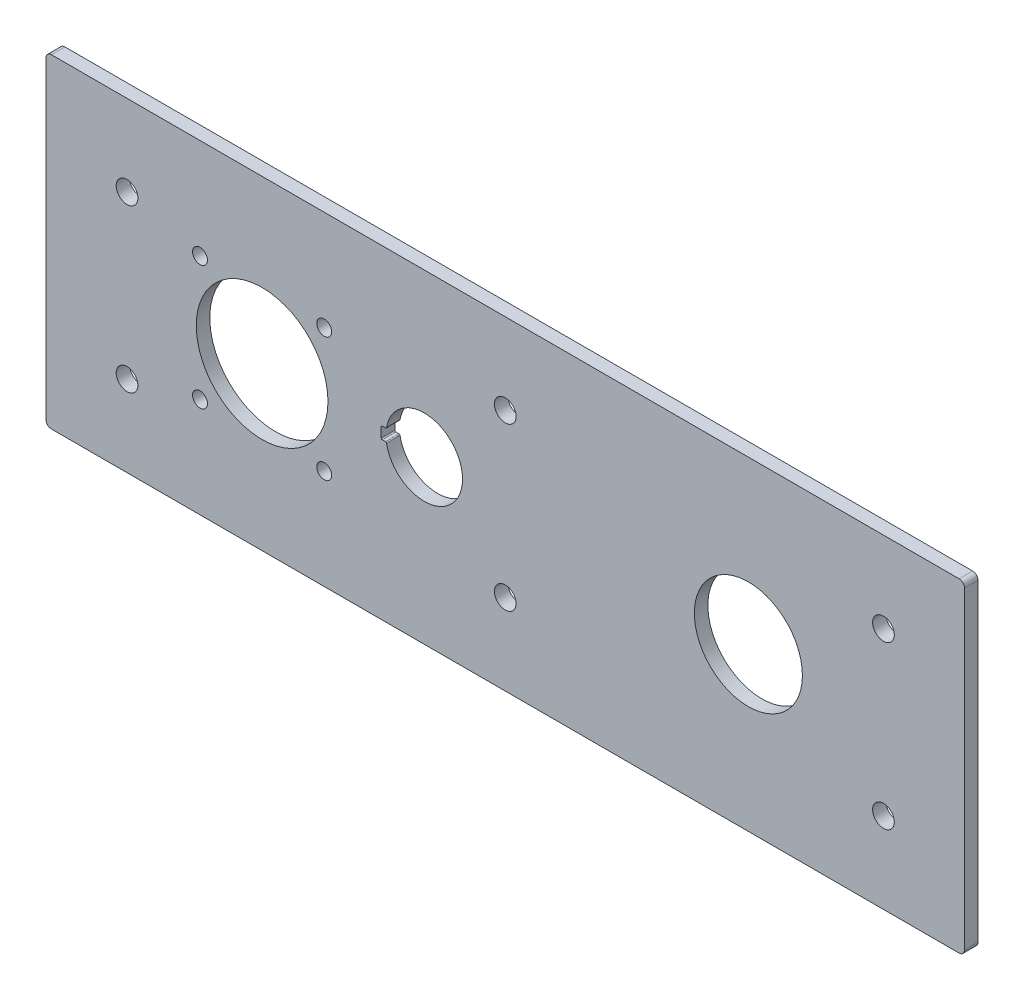
ISO-10303-21;
HEADER;
FILE_DESCRIPTION(('STEP AP214'),'2;1');
FILE_NAME('part.step','',(''),(''),'','','');
FILE_SCHEMA(('AUTOMOTIVE_DESIGN { 1 0 10303 214 1 1 1 1 }'));
ENDSEC;
DATA;
#1=APPLICATION_CONTEXT('core data for automotive mechanical design processes');
#2=APPLICATION_PROTOCOL_DEFINITION('international standard','automotive_design',2000,#1);
#3=PRODUCT_CONTEXT('',#1,'mechanical');
#4=PRODUCT('Part','Part','',(#3));
#5=PRODUCT_RELATED_PRODUCT_CATEGORY('part','',(#4));
#6=PRODUCT_DEFINITION_FORMATION('','',#4);
#7=PRODUCT_DEFINITION_CONTEXT('part definition',#1,'design');
#8=PRODUCT_DEFINITION('design','',#6,#7);
#9=PRODUCT_DEFINITION_SHAPE('','',#8);
#10=(LENGTH_UNIT() NAMED_UNIT(*) SI_UNIT(.MILLI.,.METRE.));
#11=(NAMED_UNIT(*) PLANE_ANGLE_UNIT() SI_UNIT($,.RADIAN.));
#12=(NAMED_UNIT(*) SI_UNIT($,.STERADIAN.) SOLID_ANGLE_UNIT());
#13=UNCERTAINTY_MEASURE_WITH_UNIT(LENGTH_MEASURE(1.E-05),#10,'distance_accuracy_value','');
#14=(GEOMETRIC_REPRESENTATION_CONTEXT(3) GLOBAL_UNCERTAINTY_ASSIGNED_CONTEXT((#13)) GLOBAL_UNIT_ASSIGNED_CONTEXT((#10,
#11,#12)) REPRESENTATION_CONTEXT('',''));
#15=CARTESIAN_POINT('',(0.,0.,0.));
#16=DIRECTION('',(0.,0.,1.));
#17=DIRECTION('',(1.,0.,0.));
#18=AXIS2_PLACEMENT_3D('',#15,#16,#17);
#19=CARTESIAN_POINT('',(1.27000000000001,36.83,-3.175));
#20=DIRECTION('',(0.,0.,1.));
#21=DIRECTION('',(1.,0.,0.));
#22=AXIS2_PLACEMENT_3D('',#19,#20,#21);
#23=CYLINDRICAL_SURFACE('',#22,1.27);
#24=CARTESIAN_POINT('',(1.27000000000001,36.83,0.));
#25=DIRECTION('',(0.,0.,1.));
#26=DIRECTION('',(1.,0.,0.));
#27=AXIS2_PLACEMENT_3D('',#24,#25,#26);
#28=CIRCLE('',#27,1.27);
#29=CARTESIAN_POINT('',(1.27000000000001,38.1,0.));
#30=VERTEX_POINT('',#29);
#31=CARTESIAN_POINT('',(0.,36.83,0.));
#32=VERTEX_POINT('',#31);
#33=EDGE_CURVE('E335',#30,#32,#28,.T.);
#34=ORIENTED_EDGE('',*,*,#33,.F.);
#35=DIRECTION('',(0.,0.,1.));
#36=VECTOR('',#35,1.);
#37=CARTESIAN_POINT('',(1.27000000000001,38.1,-3.175));
#38=LINE('',#37,#36);
#39=CARTESIAN_POINT('',(1.27000000000001,38.1,-3.175));
#40=VERTEX_POINT('',#39);
#41=EDGE_CURVE('E12',#40,#30,#38,.T.);
#42=ORIENTED_EDGE('',*,*,#41,.F.);
#43=CARTESIAN_POINT('',(1.27000000000001,36.83,-3.175));
#44=DIRECTION('',(0.,0.,1.));
#45=DIRECTION('',(1.,0.,0.));
#46=AXIS2_PLACEMENT_3D('',#43,#44,#45);
#47=CIRCLE('',#46,1.27);
#48=CARTESIAN_POINT('',(0.,36.83,-3.175));
#49=VERTEX_POINT('',#48);
#50=EDGE_CURVE('E351',#40,#49,#47,.T.);
#51=ORIENTED_EDGE('',*,*,#50,.T.);
#52=DIRECTION('',(0.,0.,1.));
#53=VECTOR('',#52,1.);
#54=CARTESIAN_POINT('',(0.,36.83,-3.175));
#55=LINE('',#54,#53);
#56=EDGE_CURVE('E52',#49,#32,#55,.T.);
#57=ORIENTED_EDGE('',*,*,#56,.T.);
#58=EDGE_LOOP('',(#34,#42,#51,#57));
#59=FACE_BOUND('',#58,.T.);
#60=ADVANCED_FACE('F49',(#59),#23,.T.);
#61=CARTESIAN_POINT('',(1.27000000000001,38.1,-3.175));
#62=DIRECTION('',(0.,1.,0.));
#63=DIRECTION('',(-1.,0.,0.));
#64=AXIS2_PLACEMENT_3D('',#61,#62,#63);
#65=PLANE('',#64);
#66=DIRECTION('',(-1.,0.,0.));
#67=VECTOR('',#66,1.);
#68=CARTESIAN_POINT('',(1.27000000000001,38.1,0.));
#69=LINE('',#68,#67);
#70=CARTESIAN_POINT('',(214.63,38.1,0.));
#71=VERTEX_POINT('',#70);
#72=EDGE_CURVE('E347',#71,#30,#69,.T.);
#73=ORIENTED_EDGE('',*,*,#72,.F.);
#74=DIRECTION('',(0.,0.,1.));
#75=VECTOR('',#74,1.);
#76=CARTESIAN_POINT('',(214.63,38.1,-3.175));
#77=LINE('',#76,#75);
#78=CARTESIAN_POINT('',(214.63,38.1,-3.175));
#79=VERTEX_POINT('',#78);
#80=EDGE_CURVE('E57',#79,#71,#77,.T.);
#81=ORIENTED_EDGE('',*,*,#80,.F.);
#82=DIRECTION('',(-1.,0.,0.));
#83=VECTOR('',#82,1.);
#84=CARTESIAN_POINT('',(1.27000000000001,38.1,-3.175));
#85=LINE('',#84,#83);
#86=EDGE_CURVE('E376',#79,#40,#85,.T.);
#87=ORIENTED_EDGE('',*,*,#86,.T.);
#88=ORIENTED_EDGE('',*,*,#41,.T.);
#89=EDGE_LOOP('',(#73,#81,#87,#88));
#90=FACE_BOUND('',#89,.T.);
#91=ADVANCED_FACE('F325',(#90),#65,.T.);
#92=CARTESIAN_POINT('',(214.63,36.83,-3.175));
#93=DIRECTION('',(0.,0.,1.));
#94=DIRECTION('',(1.,0.,0.));
#95=AXIS2_PLACEMENT_3D('',#92,#93,#94);
#96=CYLINDRICAL_SURFACE('',#95,1.27000000000004);
#97=CARTESIAN_POINT('',(214.63,36.83,0.));
#98=DIRECTION('',(0.,0.,1.));
#99=DIRECTION('',(-1.,0.,0.));
#100=AXIS2_PLACEMENT_3D('',#97,#98,#99);
#101=CIRCLE('',#100,1.27000000000004);
#102=CARTESIAN_POINT('',(215.9,36.83,0.));
#103=VERTEX_POINT('',#102);
#104=EDGE_CURVE('E350',#103,#71,#101,.T.);
#105=ORIENTED_EDGE('',*,*,#104,.F.);
#106=DIRECTION('',(0.,0.,1.));
#107=VECTOR('',#106,1.);
#108=CARTESIAN_POINT('',(215.9,36.83,-3.175));
#109=LINE('',#108,#107);
#110=CARTESIAN_POINT('',(215.9,36.83,-3.175));
#111=VERTEX_POINT('',#110);
#112=EDGE_CURVE('E380',#111,#103,#109,.T.);
#113=ORIENTED_EDGE('',*,*,#112,.F.);
#114=CARTESIAN_POINT('',(214.63,36.83,-3.175));
#115=DIRECTION('',(0.,0.,1.));
#116=DIRECTION('',(-1.,0.,0.));
#117=AXIS2_PLACEMENT_3D('',#114,#115,#116);
#118=CIRCLE('',#117,1.27000000000004);
#119=EDGE_CURVE('E373',#111,#79,#118,.T.);
#120=ORIENTED_EDGE('',*,*,#119,.T.);
#121=ORIENTED_EDGE('',*,*,#80,.T.);
#122=EDGE_LOOP('',(#105,#113,#120,#121));
#123=FACE_BOUND('',#122,.T.);
#124=ADVANCED_FACE('F330',(#123),#96,.T.);
#125=CARTESIAN_POINT('',(215.9,36.83,-3.175));
#126=DIRECTION('',(1.,0.,0.));
#127=DIRECTION('',(0.,0.,-1.));
#128=AXIS2_PLACEMENT_3D('',#125,#126,#127);
#129=PLANE('',#128);
#130=DIRECTION('',(0.,1.,0.));
#131=VECTOR('',#130,1.);
#132=CARTESIAN_POINT('',(215.9,36.83,0.));
#133=LINE('',#132,#131);
#134=CARTESIAN_POINT('',(215.9,-36.83,0.));
#135=VERTEX_POINT('',#134);
#136=EDGE_CURVE('E355',#135,#103,#133,.T.);
#137=ORIENTED_EDGE('',*,*,#136,.F.);
#138=DIRECTION('',(0.,0.,1.));
#139=VECTOR('',#138,1.);
#140=CARTESIAN_POINT('',(215.9,-36.83,-3.175));
#141=LINE('',#140,#139);
#142=CARTESIAN_POINT('',(215.9,-36.83,-3.175));
#143=VERTEX_POINT('',#142);
#144=EDGE_CURVE('E382',#143,#135,#141,.T.);
#145=ORIENTED_EDGE('',*,*,#144,.F.);
#146=DIRECTION('',(0.,1.,0.));
#147=VECTOR('',#146,1.);
#148=CARTESIAN_POINT('',(215.9,36.83,-3.175));
#149=LINE('',#148,#147);
#150=EDGE_CURVE('E370',#143,#111,#149,.T.);
#151=ORIENTED_EDGE('',*,*,#150,.T.);
#152=ORIENTED_EDGE('',*,*,#112,.T.);
#153=EDGE_LOOP('',(#137,#145,#151,#152));
#154=FACE_BOUND('',#153,.T.);
#155=ADVANCED_FACE('F410',(#154),#129,.T.);
#156=CARTESIAN_POINT('',(214.63,-36.83,-3.175));
#157=DIRECTION('',(0.,0.,1.));
#158=DIRECTION('',(1.,0.,0.));
#159=AXIS2_PLACEMENT_3D('',#156,#157,#158);
#160=CYLINDRICAL_SURFACE('',#159,1.27000000000004);
#161=CARTESIAN_POINT('',(214.63,-36.83,0.));
#162=DIRECTION('',(0.,0.,1.));
#163=DIRECTION('',(1.,0.,0.));
#164=AXIS2_PLACEMENT_3D('',#161,#162,#163);
#165=CIRCLE('',#164,1.27000000000004);
#166=CARTESIAN_POINT('',(214.63,-38.1000000000001,0.));
#167=VERTEX_POINT('',#166);
#168=EDGE_CURVE('E405',#167,#135,#165,.T.);
#169=ORIENTED_EDGE('',*,*,#168,.F.);
#170=DIRECTION('',(0.,0.,1.));
#171=VECTOR('',#170,1.);
#172=CARTESIAN_POINT('',(214.63,-38.1000000000001,-3.175));
#173=LINE('',#172,#171);
#174=CARTESIAN_POINT('',(214.63,-38.1000000000001,-3.175));
#175=VERTEX_POINT('',#174);
#176=EDGE_CURVE('E384',#175,#167,#173,.T.);
#177=ORIENTED_EDGE('',*,*,#176,.F.);
#178=CARTESIAN_POINT('',(214.63,-36.83,-3.175));
#179=DIRECTION('',(0.,0.,1.));
#180=DIRECTION('',(1.,0.,0.));
#181=AXIS2_PLACEMENT_3D('',#178,#179,#180);
#182=CIRCLE('',#181,1.27000000000004);
#183=EDGE_CURVE('E367',#175,#143,#182,.T.);
#184=ORIENTED_EDGE('',*,*,#183,.T.);
#185=ORIENTED_EDGE('',*,*,#144,.T.);
#186=EDGE_LOOP('',(#169,#177,#184,#185));
#187=FACE_BOUND('',#186,.T.);
#188=ADVANCED_FACE('F421',(#187),#160,.T.);
#189=CARTESIAN_POINT('',(1.27000000000001,-38.1,-3.175));
#190=DIRECTION('',(0.,-1.,0.));
#191=DIRECTION('',(1.,0.,0.));
#192=AXIS2_PLACEMENT_3D('',#189,#190,#191);
#193=PLANE('',#192);
#194=DIRECTION('',(1.,0.,0.));
#195=VECTOR('',#194,1.);
#196=CARTESIAN_POINT('',(1.27000000000001,-38.1,0.));
#197=LINE('',#196,#195);
#198=CARTESIAN_POINT('',(1.27000000000001,-38.1,0.));
#199=VERTEX_POINT('',#198);
#200=EDGE_CURVE('E399',#199,#167,#197,.T.);
#201=ORIENTED_EDGE('',*,*,#200,.F.);
#202=DIRECTION('',(0.,0.,1.));
#203=VECTOR('',#202,1.);
#204=CARTESIAN_POINT('',(1.27000000000001,-38.1,-3.175));
#205=LINE('',#204,#203);
#206=CARTESIAN_POINT('',(1.27000000000001,-38.1,-3.175));
#207=VERTEX_POINT('',#206);
#208=EDGE_CURVE('E386',#207,#199,#205,.T.);
#209=ORIENTED_EDGE('',*,*,#208,.F.);
#210=DIRECTION('',(1.,0.,0.));
#211=VECTOR('',#210,1.);
#212=CARTESIAN_POINT('',(1.27000000000001,-38.1,-3.175));
#213=LINE('',#212,#211);
#214=EDGE_CURVE('E364',#207,#175,#213,.T.);
#215=ORIENTED_EDGE('',*,*,#214,.T.);
#216=ORIENTED_EDGE('',*,*,#176,.T.);
#217=EDGE_LOOP('',(#201,#209,#215,#216));
#218=FACE_BOUND('',#217,.T.);
#219=ADVANCED_FACE('F419',(#218),#193,.T.);
#220=CARTESIAN_POINT('',(1.27000000000001,-36.83,-3.175));
#221=DIRECTION('',(0.,0.,1.));
#222=DIRECTION('',(1.,0.,0.));
#223=AXIS2_PLACEMENT_3D('',#220,#221,#222);
#224=CYLINDRICAL_SURFACE('',#223,1.27);
#225=CARTESIAN_POINT('',(1.27000000000001,-36.83,0.));
#226=DIRECTION('',(0.,0.,1.));
#227=DIRECTION('',(1.,0.,0.));
#228=AXIS2_PLACEMENT_3D('',#225,#226,#227);
#229=CIRCLE('',#228,1.27);
#230=CARTESIAN_POINT('',(0.,-36.83,0.));
#231=VERTEX_POINT('',#230);
#232=EDGE_CURVE('E395',#231,#199,#229,.T.);
#233=ORIENTED_EDGE('',*,*,#232,.F.);
#234=DIRECTION('',(0.,0.,1.));
#235=VECTOR('',#234,1.);
#236=CARTESIAN_POINT('',(0.,-36.83,-3.175));
#237=LINE('',#236,#235);
#238=CARTESIAN_POINT('',(0.,-36.83,-3.175));
#239=VERTEX_POINT('',#238);
#240=EDGE_CURVE('E387',#239,#231,#237,.T.);
#241=ORIENTED_EDGE('',*,*,#240,.F.);
#242=CARTESIAN_POINT('',(1.27000000000001,-36.83,-3.175));
#243=DIRECTION('',(0.,0.,1.));
#244=DIRECTION('',(1.,0.,0.));
#245=AXIS2_PLACEMENT_3D('',#242,#243,#244);
#246=CIRCLE('',#245,1.27);
#247=EDGE_CURVE('E361',#239,#207,#246,.T.);
#248=ORIENTED_EDGE('',*,*,#247,.T.);
#249=ORIENTED_EDGE('',*,*,#208,.T.);
#250=EDGE_LOOP('',(#233,#241,#248,#249));
#251=FACE_BOUND('',#250,.T.);
#252=ADVANCED_FACE('F396',(#251),#224,.T.);
#253=CARTESIAN_POINT('',(0.,36.83,-3.175));
#254=DIRECTION('',(-1.,0.,0.));
#255=DIRECTION('',(0.,0.,1.));
#256=AXIS2_PLACEMENT_3D('',#253,#254,#255);
#257=PLANE('',#256);
#258=DIRECTION('',(0.,-1.,0.));
#259=VECTOR('',#258,1.);
#260=CARTESIAN_POINT('',(0.,36.83,0.));
#261=LINE('',#260,#259);
#262=EDGE_CURVE('E342',#32,#231,#261,.T.);
#263=ORIENTED_EDGE('',*,*,#262,.F.);
#264=ORIENTED_EDGE('',*,*,#56,.F.);
#265=DIRECTION('',(0.,-1.,0.));
#266=VECTOR('',#265,1.);
#267=CARTESIAN_POINT('',(0.,36.83,-3.175));
#268=LINE('',#267,#266);
#269=EDGE_CURVE('E353',#49,#239,#268,.T.);
#270=ORIENTED_EDGE('',*,*,#269,.T.);
#271=ORIENTED_EDGE('',*,*,#240,.T.);
#272=EDGE_LOOP('',(#263,#264,#270,#271));
#273=FACE_BOUND('',#272,.T.);
#274=ADVANCED_FACE('F390',(#273),#257,.T.);
#275=CARTESIAN_POINT('',(1.27000000000001,36.83,-3.175));
#276=DIRECTION('',(0.,0.,1.));
#277=DIRECTION('',(1.,0.,0.));
#278=AXIS2_PLACEMENT_3D('',#275,#276,#277);
#279=PLANE('',#278);
#280=CARTESIAN_POINT('',(36.195,14.605,-3.175));
#281=DIRECTION('',(0.,0.,1.));
#282=DIRECTION('',(1.,0.,0.));
#283=AXIS2_PLACEMENT_3D('',#280,#281,#282);
#284=CIRCLE('',#283,1.7526);
#285=CARTESIAN_POINT('',(37.9476,14.605,-3.175));
#286=VERTEX_POINT('',#285);
#287=EDGE_CURVE('E287',#286,#286,#284,.T.);
#288=ORIENTED_EDGE('',*,*,#287,.T.);
#289=EDGE_LOOP('',(#288));
#290=FACE_BOUND('',#289,.T.);
#291=CARTESIAN_POINT('',(65.405,14.605,-3.175));
#292=DIRECTION('',(0.,0.,1.));
#293=DIRECTION('',(1.,0.,0.));
#294=AXIS2_PLACEMENT_3D('',#291,#292,#293);
#295=CIRCLE('',#294,1.75259999999999);
#296=CARTESIAN_POINT('',(67.1576,14.605,-3.175));
#297=VERTEX_POINT('',#296);
#298=EDGE_CURVE('E281',#297,#297,#295,.T.);
#299=ORIENTED_EDGE('',*,*,#298,.T.);
#300=EDGE_LOOP('',(#299));
#301=FACE_BOUND('',#300,.T.);
#302=CARTESIAN_POINT('',(65.405,-14.605,-3.175));
#303=DIRECTION('',(0.,0.,1.));
#304=DIRECTION('',(1.,0.,0.));
#305=AXIS2_PLACEMENT_3D('',#302,#303,#304);
#306=CIRCLE('',#305,1.75259999999999);
#307=CARTESIAN_POINT('',(67.1576,-14.605,-3.175));
#308=VERTEX_POINT('',#307);
#309=EDGE_CURVE('E275',#308,#308,#306,.T.);
#310=ORIENTED_EDGE('',*,*,#309,.T.);
#311=EDGE_LOOP('',(#310));
#312=FACE_BOUND('',#311,.T.);
#313=CARTESIAN_POINT('',(36.195,-14.605,-3.175));
#314=DIRECTION('',(0.,0.,1.));
#315=DIRECTION('',(1.,0.,0.));
#316=AXIS2_PLACEMENT_3D('',#313,#314,#315);
#317=CIRCLE('',#316,1.7526);
#318=CARTESIAN_POINT('',(37.9476,-14.605,-3.175));
#319=VERTEX_POINT('',#318);
#320=EDGE_CURVE('E269',#319,#319,#317,.T.);
#321=ORIENTED_EDGE('',*,*,#320,.T.);
#322=EDGE_LOOP('',(#321));
#323=FACE_BOUND('',#322,.T.);
#324=CARTESIAN_POINT('',(107.95,-19.05,-3.175));
#325=DIRECTION('',(0.,0.,1.));
#326=DIRECTION('',(1.,0.,0.));
#327=AXIS2_PLACEMENT_3D('',#324,#325,#326);
#328=CIRCLE('',#327,2.55270000000001);
#329=CARTESIAN_POINT('',(110.5027,-19.05,-3.175));
#330=VERTEX_POINT('',#329);
#331=EDGE_CURVE('E260',#330,#330,#328,.T.);
#332=ORIENTED_EDGE('',*,*,#331,.T.);
#333=EDGE_LOOP('',(#332));
#334=FACE_BOUND('',#333,.T.);
#335=DIRECTION('',(-1.,0.,0.));
#336=VECTOR('',#335,1.);
#337=CARTESIAN_POINT('',(79.7900978111727,1.397,-3.175));
#338=LINE('',#337,#336);
#339=CARTESIAN_POINT('',(79.7900978111727,1.397,-3.175));
#340=VERTEX_POINT('',#339);
#341=CARTESIAN_POINT('',(79.0575,1.397,-3.175));
#342=VERTEX_POINT('',#341);
#343=EDGE_CURVE('E670',#340,#342,#338,.T.);
#344=ORIENTED_EDGE('',*,*,#343,.T.);
#345=CARTESIAN_POINT('',(79.0575,1.143,-3.175));
#346=DIRECTION('',(0.,0.,1.));
#347=DIRECTION('',(1.,0.,0.));
#348=AXIS2_PLACEMENT_3D('',#345,#346,#347);
#349=CIRCLE('',#348,0.254000000000002);
#350=CARTESIAN_POINT('',(78.8035,1.143,-3.175));
#351=VERTEX_POINT('',#350);
#352=EDGE_CURVE('E646',#342,#351,#349,.T.);
#353=ORIENTED_EDGE('',*,*,#352,.T.);
#354=DIRECTION('',(0.,-1.,0.));
#355=VECTOR('',#354,1.);
#356=CARTESIAN_POINT('',(78.8035,1.143,-3.175));
#357=LINE('',#356,#355);
#358=CARTESIAN_POINT('',(78.8035,-1.14299999999999,-3.175));
#359=VERTEX_POINT('',#358);
#360=EDGE_CURVE('E651',#351,#359,#357,.T.);
#361=ORIENTED_EDGE('',*,*,#360,.T.);
#362=CARTESIAN_POINT('',(79.0575,-1.14299999999999,-3.175));
#363=DIRECTION('',(0.,0.,1.));
#364=DIRECTION('',(-1.,0.,0.));
#365=AXIS2_PLACEMENT_3D('',#362,#363,#364);
#366=CIRCLE('',#365,0.254000000000002);
#367=CARTESIAN_POINT('',(79.0575,-1.39699999999999,-3.175));
#368=VERTEX_POINT('',#367);
#369=EDGE_CURVE('E65',#359,#368,#366,.T.);
#370=ORIENTED_EDGE('',*,*,#369,.T.);
#371=DIRECTION('',(1.,0.,0.));
#372=VECTOR('',#371,1.);
#373=CARTESIAN_POINT('',(79.7900978111727,-1.39699999999999,-3.175));
#374=LINE('',#373,#372);
#375=CARTESIAN_POINT('',(79.7900978111727,-1.397,-3.175));
#376=VERTEX_POINT('',#375);
#377=EDGE_CURVE('E658',#368,#376,#374,.T.);
#378=ORIENTED_EDGE('',*,*,#377,.T.);
#379=CARTESIAN_POINT('',(79.7900978111727,-1.65099999999999,-3.175));
#380=DIRECTION('',(0.,0.,-1.));
#381=DIRECTION('',(-1.,0.,0.));
#382=AXIS2_PLACEMENT_3D('',#379,#380,#381);
#383=CIRCLE('',#382,0.253999999999992);
#384=CARTESIAN_POINT('',(80.040026540633,-1.60570507544581,-3.175));
#385=VERTEX_POINT('',#384);
#386=EDGE_CURVE('E661',#376,#385,#383,.T.);
#387=ORIENTED_EDGE('',*,*,#386,.T.);
#388=CARTESIAN_POINT('',(88.9,0.,-3.175));
#389=DIRECTION('',(0.,0.,1.));
#390=DIRECTION('',(1.,0.,0.));
#391=AXIS2_PLACEMENT_3D('',#388,#389,#390);
#392=CIRCLE('',#391,9.00430000000001);
#393=CARTESIAN_POINT('',(80.040026540633,1.60570507544581,-3.175));
#394=VERTEX_POINT('',#393);
#395=EDGE_CURVE('E664',#385,#394,#392,.T.);
#396=ORIENTED_EDGE('',*,*,#395,.T.);
#397=CARTESIAN_POINT('',(79.7900978111727,1.651,-3.175));
#398=DIRECTION('',(0.,0.,-1.));
#399=DIRECTION('',(1.,0.,0.));
#400=AXIS2_PLACEMENT_3D('',#397,#398,#399);
#401=CIRCLE('',#400,0.253999999999992);
#402=EDGE_CURVE('E667',#394,#340,#401,.T.);
#403=ORIENTED_EDGE('',*,*,#402,.T.);
#404=EDGE_LOOP('',(#344,#353,#361,#370,#378,#387,#396,#403));
#405=FACE_BOUND('',#404,.T.);
#406=CARTESIAN_POINT('',(19.05,-19.05,-3.175));
#407=DIRECTION('',(0.,0.,1.));
#408=DIRECTION('',(-1.,0.,0.));
#409=AXIS2_PLACEMENT_3D('',#406,#407,#408);
#410=CIRCLE('',#409,2.5527);
#411=CARTESIAN_POINT('',(16.4973,-19.05,-3.175));
#412=VERTEX_POINT('',#411);
#413=EDGE_CURVE('E687',#412,#412,#410,.T.);
#414=ORIENTED_EDGE('',*,*,#413,.T.);
#415=EDGE_LOOP('',(#414));
#416=FACE_BOUND('',#415,.T.);
#417=CARTESIAN_POINT('',(196.85,-19.05,-3.175));
#418=DIRECTION('',(0.,0.,1.));
#419=DIRECTION('',(-1.,0.,0.));
#420=AXIS2_PLACEMENT_3D('',#417,#418,#419);
#421=CIRCLE('',#420,2.55269999999998);
#422=CARTESIAN_POINT('',(194.2973,-19.05,-3.175));
#423=VERTEX_POINT('',#422);
#424=EDGE_CURVE('E693',#423,#423,#421,.T.);
#425=ORIENTED_EDGE('',*,*,#424,.T.);
#426=EDGE_LOOP('',(#425));
#427=FACE_BOUND('',#426,.T.);
#428=CARTESIAN_POINT('',(196.85,19.05,-3.175));
#429=DIRECTION('',(0.,0.,1.));
#430=DIRECTION('',(1.,0.,0.));
#431=AXIS2_PLACEMENT_3D('',#428,#429,#430);
#432=CIRCLE('',#431,2.55269999999998);
#433=CARTESIAN_POINT('',(199.4027,19.05,-3.175));
#434=VERTEX_POINT('',#433);
#435=EDGE_CURVE('E699',#434,#434,#432,.T.);
#436=ORIENTED_EDGE('',*,*,#435,.T.);
#437=EDGE_LOOP('',(#436));
#438=FACE_BOUND('',#437,.T.);
#439=CARTESIAN_POINT('',(19.05,19.05,-3.175));
#440=DIRECTION('',(0.,0.,1.));
#441=DIRECTION('',(1.,0.,0.));
#442=AXIS2_PLACEMENT_3D('',#439,#440,#441);
#443=CIRCLE('',#442,2.5527);
#444=CARTESIAN_POINT('',(21.6027,19.05,-3.175));
#445=VERTEX_POINT('',#444);
#446=EDGE_CURVE('E705',#445,#445,#443,.T.);
#447=ORIENTED_EDGE('',*,*,#446,.T.);
#448=EDGE_LOOP('',(#447));
#449=FACE_BOUND('',#448,.T.);
#450=CARTESIAN_POINT('',(107.95,19.05,-3.175));
#451=DIRECTION('',(0.,0.,1.));
#452=DIRECTION('',(1.,0.,0.));
#453=AXIS2_PLACEMENT_3D('',#450,#451,#452);
#454=CIRCLE('',#453,2.55270000000001);
#455=CARTESIAN_POINT('',(110.5027,19.05,-3.175));
#456=VERTEX_POINT('',#455);
#457=EDGE_CURVE('E229',#456,#456,#454,.T.);
#458=ORIENTED_EDGE('',*,*,#457,.T.);
#459=EDGE_LOOP('',(#458));
#460=FACE_BOUND('',#459,.T.);
#461=CARTESIAN_POINT('',(50.8,0.,-3.175));
#462=DIRECTION('',(0.,0.,1.));
#463=DIRECTION('',(1.,0.,0.));
#464=AXIS2_PLACEMENT_3D('',#461,#462,#463);
#465=CIRCLE('',#464,15.4813);
#466=CARTESIAN_POINT('',(66.2813,0.,-3.175));
#467=VERTEX_POINT('',#466);
#468=EDGE_CURVE('E228',#467,#467,#465,.T.);
#469=ORIENTED_EDGE('',*,*,#468,.T.);
#470=EDGE_LOOP('',(#469));
#471=FACE_BOUND('',#470,.T.);
#472=CARTESIAN_POINT('',(165.1,0.,-3.175));
#473=DIRECTION('',(0.,0.,1.));
#474=DIRECTION('',(1.,0.,0.));
#475=AXIS2_PLACEMENT_3D('',#472,#473,#474);
#476=CIRCLE('',#475,12.7);
#477=CARTESIAN_POINT('',(177.8,0.,-3.175));
#478=VERTEX_POINT('',#477);
#479=EDGE_CURVE('E343',#478,#478,#476,.T.);
#480=ORIENTED_EDGE('',*,*,#479,.T.);
#481=EDGE_LOOP('',(#480));
#482=FACE_BOUND('',#481,.T.);
#483=ORIENTED_EDGE('',*,*,#50,.F.);
#484=ORIENTED_EDGE('',*,*,#86,.F.);
#485=ORIENTED_EDGE('',*,*,#119,.F.);
#486=ORIENTED_EDGE('',*,*,#150,.F.);
#487=ORIENTED_EDGE('',*,*,#183,.F.);
#488=ORIENTED_EDGE('',*,*,#214,.F.);
#489=ORIENTED_EDGE('',*,*,#247,.F.);
#490=ORIENTED_EDGE('',*,*,#269,.F.);
#491=EDGE_LOOP('',(#483,#484,#485,#486,#487,#488,#489,#490));
#492=FACE_BOUND('',#491,.T.);
#493=ADVANCED_FACE('F299',(#290,#301,#312,#323,#334,#405,#416,#427,#438,#449,#460,#471,#482,
#492),#279,.F.);
#494=CARTESIAN_POINT('',(1.27000000000001,36.83,0.));
#495=DIRECTION('',(0.,0.,1.));
#496=DIRECTION('',(1.,0.,0.));
#497=AXIS2_PLACEMENT_3D('',#494,#495,#496);
#498=PLANE('',#497);
#499=CARTESIAN_POINT('',(36.195,14.605,0.));
#500=DIRECTION('',(0.,0.,1.));
#501=DIRECTION('',(1.,0.,0.));
#502=AXIS2_PLACEMENT_3D('',#499,#500,#501);
#503=CIRCLE('',#502,1.75259999999999);
#504=CARTESIAN_POINT('',(37.9475999999999,14.605,0.));
#505=VERTEX_POINT('',#504);
#506=EDGE_CURVE('E290',#505,#505,#503,.T.);
#507=ORIENTED_EDGE('',*,*,#506,.F.);
#508=EDGE_LOOP('',(#507));
#509=FACE_BOUND('',#508,.T.);
#510=CARTESIAN_POINT('',(65.405,14.605,0.));
#511=DIRECTION('',(0.,0.,1.));
#512=DIRECTION('',(1.,0.,0.));
#513=AXIS2_PLACEMENT_3D('',#510,#511,#512);
#514=CIRCLE('',#513,1.75259999999999);
#515=CARTESIAN_POINT('',(67.1576,14.605,0.));
#516=VERTEX_POINT('',#515);
#517=EDGE_CURVE('E284',#516,#516,#514,.T.);
#518=ORIENTED_EDGE('',*,*,#517,.F.);
#519=EDGE_LOOP('',(#518));
#520=FACE_BOUND('',#519,.T.);
#521=CARTESIAN_POINT('',(65.405,-14.605,0.));
#522=DIRECTION('',(0.,0.,1.));
#523=DIRECTION('',(1.,0.,0.));
#524=AXIS2_PLACEMENT_3D('',#521,#522,#523);
#525=CIRCLE('',#524,1.75259999999999);
#526=CARTESIAN_POINT('',(67.1576,-14.605,0.));
#527=VERTEX_POINT('',#526);
#528=EDGE_CURVE('E278',#527,#527,#525,.T.);
#529=ORIENTED_EDGE('',*,*,#528,.F.);
#530=EDGE_LOOP('',(#529));
#531=FACE_BOUND('',#530,.T.);
#532=CARTESIAN_POINT('',(36.195,-14.605,0.));
#533=DIRECTION('',(0.,0.,1.));
#534=DIRECTION('',(1.,0.,0.));
#535=AXIS2_PLACEMENT_3D('',#532,#533,#534);
#536=CIRCLE('',#535,1.75259999999999);
#537=CARTESIAN_POINT('',(37.9476,-14.605,0.));
#538=VERTEX_POINT('',#537);
#539=EDGE_CURVE('E272',#538,#538,#536,.T.);
#540=ORIENTED_EDGE('',*,*,#539,.F.);
#541=EDGE_LOOP('',(#540));
#542=FACE_BOUND('',#541,.T.);
#543=CARTESIAN_POINT('',(107.95,-19.05,0.));
#544=DIRECTION('',(0.,0.,1.));
#545=DIRECTION('',(1.,0.,0.));
#546=AXIS2_PLACEMENT_3D('',#543,#544,#545);
#547=CIRCLE('',#546,2.55270000000001);
#548=CARTESIAN_POINT('',(110.5027,-19.05,0.));
#549=VERTEX_POINT('',#548);
#550=EDGE_CURVE('E266',#549,#549,#547,.T.);
#551=ORIENTED_EDGE('',*,*,#550,.F.);
#552=EDGE_LOOP('',(#551));
#553=FACE_BOUND('',#552,.T.);
#554=CARTESIAN_POINT('',(79.0575,1.143,0.));
#555=DIRECTION('',(0.,0.,1.));
#556=DIRECTION('',(1.,0.,0.));
#557=AXIS2_PLACEMENT_3D('',#554,#555,#556);
#558=CIRCLE('',#557,0.254000000000002);
#559=CARTESIAN_POINT('',(79.0575,1.397,0.));
#560=VERTEX_POINT('',#559);
#561=CARTESIAN_POINT('',(78.8035,1.143,0.));
#562=VERTEX_POINT('',#561);
#563=EDGE_CURVE('E73',#560,#562,#558,.T.);
#564=ORIENTED_EDGE('',*,*,#563,.F.);
#565=DIRECTION('',(-1.,0.,0.));
#566=VECTOR('',#565,1.);
#567=CARTESIAN_POINT('',(79.7900978111727,1.397,0.));
#568=LINE('',#567,#566);
#569=CARTESIAN_POINT('',(79.7900978111727,1.397,0.));
#570=VERTEX_POINT('',#569);
#571=EDGE_CURVE('E246',#570,#560,#568,.T.);
#572=ORIENTED_EDGE('',*,*,#571,.F.);
#573=CARTESIAN_POINT('',(79.7900978111727,1.651,0.));
#574=DIRECTION('',(0.,0.,-1.));
#575=DIRECTION('',(1.,0.,0.));
#576=AXIS2_PLACEMENT_3D('',#573,#574,#575);
#577=CIRCLE('',#576,0.253999999999992);
#578=CARTESIAN_POINT('',(80.040026540633,1.60570507544581,0.));
#579=VERTEX_POINT('',#578);
#580=EDGE_CURVE('E242',#579,#570,#577,.T.);
#581=ORIENTED_EDGE('',*,*,#580,.F.);
#582=CARTESIAN_POINT('',(88.9,0.,0.));
#583=DIRECTION('',(0.,0.,1.));
#584=DIRECTION('',(1.,0.,0.));
#585=AXIS2_PLACEMENT_3D('',#582,#583,#584);
#586=CIRCLE('',#585,9.00430000000001);
#587=CARTESIAN_POINT('',(80.040026540633,-1.60570507544581,0.));
#588=VERTEX_POINT('',#587);
#589=EDGE_CURVE('E211',#588,#579,#586,.T.);
#590=ORIENTED_EDGE('',*,*,#589,.F.);
#591=CARTESIAN_POINT('',(79.7900978111727,-1.65099999999999,0.));
#592=DIRECTION('',(0.,0.,-1.));
#593=DIRECTION('',(-1.,0.,0.));
#594=AXIS2_PLACEMENT_3D('',#591,#592,#593);
#595=CIRCLE('',#594,0.253999999999992);
#596=CARTESIAN_POINT('',(79.7900978111727,-1.397,0.));
#597=VERTEX_POINT('',#596);
#598=EDGE_CURVE('E187',#597,#588,#595,.T.);
#599=ORIENTED_EDGE('',*,*,#598,.F.);
#600=DIRECTION('',(1.,0.,0.));
#601=VECTOR('',#600,1.);
#602=CARTESIAN_POINT('',(79.7900978111727,-1.39699999999999,0.));
#603=LINE('',#602,#601);
#604=CARTESIAN_POINT('',(79.0575,-1.39699999999999,0.));
#605=VERTEX_POINT('',#604);
#606=EDGE_CURVE('E182',#605,#597,#603,.T.);
#607=ORIENTED_EDGE('',*,*,#606,.F.);
#608=CARTESIAN_POINT('',(79.0575,-1.14299999999999,0.));
#609=DIRECTION('',(0.,0.,1.));
#610=DIRECTION('',(-1.,0.,0.));
#611=AXIS2_PLACEMENT_3D('',#608,#609,#610);
#612=CIRCLE('',#611,0.254000000000002);
#613=CARTESIAN_POINT('',(78.8035,-1.14299999999999,0.));
#614=VERTEX_POINT('',#613);
#615=EDGE_CURVE('E164',#614,#605,#612,.T.);
#616=ORIENTED_EDGE('',*,*,#615,.F.);
#617=DIRECTION('',(0.,-1.,0.));
#618=VECTOR('',#617,1.);
#619=CARTESIAN_POINT('',(78.8035,1.143,0.));
#620=LINE('',#619,#618);
#621=EDGE_CURVE('E173',#562,#614,#620,.T.);
#622=ORIENTED_EDGE('',*,*,#621,.F.);
#623=EDGE_LOOP('',(#564,#572,#581,#590,#599,#607,#616,#622));
#624=FACE_BOUND('',#623,.T.);
#625=CARTESIAN_POINT('',(19.05,-19.05,0.));
#626=DIRECTION('',(0.,0.,1.));
#627=DIRECTION('',(-1.,0.,0.));
#628=AXIS2_PLACEMENT_3D('',#625,#626,#627);
#629=CIRCLE('',#628,2.5527);
#630=CARTESIAN_POINT('',(16.4973,-19.05,0.));
#631=VERTEX_POINT('',#630);
#632=EDGE_CURVE('E674',#631,#631,#629,.T.);
#633=ORIENTED_EDGE('',*,*,#632,.F.);
#634=EDGE_LOOP('',(#633));
#635=FACE_BOUND('',#634,.T.);
#636=CARTESIAN_POINT('',(196.85,-19.05,0.));
#637=DIRECTION('',(0.,0.,1.));
#638=DIRECTION('',(-1.,0.,0.));
#639=AXIS2_PLACEMENT_3D('',#636,#637,#638);
#640=CIRCLE('',#639,2.55269999999998);
#641=CARTESIAN_POINT('',(194.2973,-19.05,0.));
#642=VERTEX_POINT('',#641);
#643=EDGE_CURVE('E690',#642,#642,#640,.T.);
#644=ORIENTED_EDGE('',*,*,#643,.F.);
#645=EDGE_LOOP('',(#644));
#646=FACE_BOUND('',#645,.T.);
#647=CARTESIAN_POINT('',(196.85,19.05,0.));
#648=DIRECTION('',(0.,0.,1.));
#649=DIRECTION('',(1.,0.,0.));
#650=AXIS2_PLACEMENT_3D('',#647,#648,#649);
#651=CIRCLE('',#650,2.55269999999998);
#652=CARTESIAN_POINT('',(199.4027,19.05,0.));
#653=VERTEX_POINT('',#652);
#654=EDGE_CURVE('E696',#653,#653,#651,.T.);
#655=ORIENTED_EDGE('',*,*,#654,.F.);
#656=EDGE_LOOP('',(#655));
#657=FACE_BOUND('',#656,.T.);
#658=CARTESIAN_POINT('',(19.05,19.05,0.));
#659=DIRECTION('',(0.,0.,1.));
#660=DIRECTION('',(1.,0.,0.));
#661=AXIS2_PLACEMENT_3D('',#658,#659,#660);
#662=CIRCLE('',#661,2.5527);
#663=CARTESIAN_POINT('',(21.6027,19.05,0.));
#664=VERTEX_POINT('',#663);
#665=EDGE_CURVE('E702',#664,#664,#662,.T.);
#666=ORIENTED_EDGE('',*,*,#665,.F.);
#667=EDGE_LOOP('',(#666));
#668=FACE_BOUND('',#667,.T.);
#669=CARTESIAN_POINT('',(107.95,19.05,0.));
#670=DIRECTION('',(0.,0.,1.));
#671=DIRECTION('',(1.,0.,0.));
#672=AXIS2_PLACEMENT_3D('',#669,#670,#671);
#673=CIRCLE('',#672,2.55270000000001);
#674=CARTESIAN_POINT('',(110.5027,19.05,0.));
#675=VERTEX_POINT('',#674);
#676=EDGE_CURVE('E707',#675,#675,#673,.T.);
#677=ORIENTED_EDGE('',*,*,#676,.F.);
#678=EDGE_LOOP('',(#677));
#679=FACE_BOUND('',#678,.T.);
#680=CARTESIAN_POINT('',(50.8,0.,0.));
#681=DIRECTION('',(0.,0.,1.));
#682=DIRECTION('',(1.,0.,0.));
#683=AXIS2_PLACEMENT_3D('',#680,#681,#682);
#684=CIRCLE('',#683,15.4813);
#685=CARTESIAN_POINT('',(66.2813,0.,0.));
#686=VERTEX_POINT('',#685);
#687=EDGE_CURVE('E222',#686,#686,#684,.T.);
#688=ORIENTED_EDGE('',*,*,#687,.F.);
#689=EDGE_LOOP('',(#688));
#690=FACE_BOUND('',#689,.T.);
#691=CARTESIAN_POINT('',(165.1,0.,0.));
#692=DIRECTION('',(0.,0.,1.));
#693=DIRECTION('',(1.,0.,0.));
#694=AXIS2_PLACEMENT_3D('',#691,#692,#693);
#695=CIRCLE('',#694,12.7);
#696=CARTESIAN_POINT('',(177.8,0.,0.));
#697=VERTEX_POINT('',#696);
#698=EDGE_CURVE('E720',#697,#697,#695,.T.);
#699=ORIENTED_EDGE('',*,*,#698,.F.);
#700=EDGE_LOOP('',(#699));
#701=FACE_BOUND('',#700,.T.);
#702=ORIENTED_EDGE('',*,*,#33,.T.);
#703=ORIENTED_EDGE('',*,*,#262,.T.);
#704=ORIENTED_EDGE('',*,*,#232,.T.);
#705=ORIENTED_EDGE('',*,*,#200,.T.);
#706=ORIENTED_EDGE('',*,*,#168,.T.);
#707=ORIENTED_EDGE('',*,*,#136,.T.);
#708=ORIENTED_EDGE('',*,*,#104,.T.);
#709=ORIENTED_EDGE('',*,*,#72,.T.);
#710=EDGE_LOOP('',(#702,#703,#704,#705,#706,#707,#708,#709));
#711=FACE_BOUND('',#710,.T.);
#712=ADVANCED_FACE('F178',(#509,#520,#531,#542,#553,#624,#635,#646,#657,#668,#679,#690,#701,
#711),#498,.T.);
#713=CARTESIAN_POINT('',(165.1,0.,-3.175));
#714=DIRECTION('',(0.,0.,1.));
#715=DIRECTION('',(1.,0.,0.));
#716=AXIS2_PLACEMENT_3D('',#713,#714,#715);
#717=CYLINDRICAL_SURFACE('',#716,12.7);
#718=ORIENTED_EDGE('',*,*,#479,.F.);
#719=EDGE_LOOP('',(#718));
#720=FACE_BOUND('',#719,.T.);
#721=ORIENTED_EDGE('',*,*,#698,.T.);
#722=EDGE_LOOP('',(#721));
#723=FACE_BOUND('',#722,.T.);
#724=ADVANCED_FACE('F298',(#720,#723),#717,.F.);
#725=CARTESIAN_POINT('',(50.8,0.,-3.175));
#726=DIRECTION('',(0.,0.,1.));
#727=DIRECTION('',(1.,0.,0.));
#728=AXIS2_PLACEMENT_3D('',#725,#726,#727);
#729=CYLINDRICAL_SURFACE('',#728,15.4813);
#730=ORIENTED_EDGE('',*,*,#468,.F.);
#731=EDGE_LOOP('',(#730));
#732=FACE_BOUND('',#731,.T.);
#733=ORIENTED_EDGE('',*,*,#687,.T.);
#734=EDGE_LOOP('',(#733));
#735=FACE_BOUND('',#734,.T.);
#736=ADVANCED_FACE('F498',(#732,#735),#729,.F.);
#737=CARTESIAN_POINT('',(107.95,19.05,-3.175));
#738=DIRECTION('',(0.,0.,1.));
#739=DIRECTION('',(1.,0.,0.));
#740=AXIS2_PLACEMENT_3D('',#737,#738,#739);
#741=CYLINDRICAL_SURFACE('',#740,2.55270000000001);
#742=ORIENTED_EDGE('',*,*,#457,.F.);
#743=EDGE_LOOP('',(#742));
#744=FACE_BOUND('',#743,.T.);
#745=ORIENTED_EDGE('',*,*,#676,.T.);
#746=EDGE_LOOP('',(#745));
#747=FACE_BOUND('',#746,.T.);
#748=ADVANCED_FACE('F507',(#744,#747),#741,.F.);
#749=CARTESIAN_POINT('',(19.05,19.05,-3.175));
#750=DIRECTION('',(0.,0.,1.));
#751=DIRECTION('',(1.,0.,0.));
#752=AXIS2_PLACEMENT_3D('',#749,#750,#751);
#753=CYLINDRICAL_SURFACE('',#752,2.5527);
#754=ORIENTED_EDGE('',*,*,#446,.F.);
#755=EDGE_LOOP('',(#754));
#756=FACE_BOUND('',#755,.T.);
#757=ORIENTED_EDGE('',*,*,#665,.T.);
#758=EDGE_LOOP('',(#757));
#759=FACE_BOUND('',#758,.T.);
#760=ADVANCED_FACE('F518',(#756,#759),#753,.F.);
#761=CARTESIAN_POINT('',(196.85,19.05,-3.175));
#762=DIRECTION('',(0.,0.,1.));
#763=DIRECTION('',(1.,0.,0.));
#764=AXIS2_PLACEMENT_3D('',#761,#762,#763);
#765=CYLINDRICAL_SURFACE('',#764,2.55269999999998);
#766=ORIENTED_EDGE('',*,*,#435,.F.);
#767=EDGE_LOOP('',(#766));
#768=FACE_BOUND('',#767,.T.);
#769=ORIENTED_EDGE('',*,*,#654,.T.);
#770=EDGE_LOOP('',(#769));
#771=FACE_BOUND('',#770,.T.);
#772=ADVANCED_FACE('F528',(#768,#771),#765,.F.);
#773=CARTESIAN_POINT('',(196.85,-19.05,-3.175));
#774=DIRECTION('',(0.,0.,1.));
#775=DIRECTION('',(1.,0.,0.));
#776=AXIS2_PLACEMENT_3D('',#773,#774,#775);
#777=CYLINDRICAL_SURFACE('',#776,2.55269999999998);
#778=ORIENTED_EDGE('',*,*,#424,.F.);
#779=EDGE_LOOP('',(#778));
#780=FACE_BOUND('',#779,.T.);
#781=ORIENTED_EDGE('',*,*,#643,.T.);
#782=EDGE_LOOP('',(#781));
#783=FACE_BOUND('',#782,.T.);
#784=ADVANCED_FACE('F538',(#780,#783),#777,.F.);
#785=CARTESIAN_POINT('',(19.05,-19.05,-3.175));
#786=DIRECTION('',(0.,0.,1.));
#787=DIRECTION('',(1.,0.,0.));
#788=AXIS2_PLACEMENT_3D('',#785,#786,#787);
#789=CYLINDRICAL_SURFACE('',#788,2.5527);
#790=ORIENTED_EDGE('',*,*,#413,.F.);
#791=EDGE_LOOP('',(#790));
#792=FACE_BOUND('',#791,.T.);
#793=ORIENTED_EDGE('',*,*,#632,.T.);
#794=EDGE_LOOP('',(#793));
#795=FACE_BOUND('',#794,.T.);
#796=ADVANCED_FACE('F548',(#792,#795),#789,.F.);
#797=CARTESIAN_POINT('',(79.0575,1.143,-3.175));
#798=DIRECTION('',(0.,0.,1.));
#799=DIRECTION('',(1.,0.,0.));
#800=AXIS2_PLACEMENT_3D('',#797,#798,#799);
#801=CYLINDRICAL_SURFACE('',#800,0.254000000000002);
#802=ORIENTED_EDGE('',*,*,#563,.T.);
#803=DIRECTION('',(0.,0.,1.));
#804=VECTOR('',#803,1.);
#805=CARTESIAN_POINT('',(78.8035,1.143,-3.175));
#806=LINE('',#805,#804);
#807=EDGE_CURVE('E170',#351,#562,#806,.T.);
#808=ORIENTED_EDGE('',*,*,#807,.F.);
#809=ORIENTED_EDGE('',*,*,#352,.F.);
#810=DIRECTION('',(0.,0.,1.));
#811=VECTOR('',#810,1.);
#812=CARTESIAN_POINT('',(79.0575,1.397,-3.175));
#813=LINE('',#812,#811);
#814=EDGE_CURVE('E672',#342,#560,#813,.T.);
#815=ORIENTED_EDGE('',*,*,#814,.T.);
#816=EDGE_LOOP('',(#802,#808,#809,#815));
#817=FACE_BOUND('',#816,.T.);
#818=ADVANCED_FACE('F558',(#817),#801,.F.);
#819=CARTESIAN_POINT('',(79.7900978111727,1.397,-3.175));
#820=DIRECTION('',(0.,1.,0.));
#821=DIRECTION('',(-1.,0.,0.));
#822=AXIS2_PLACEMENT_3D('',#819,#820,#821);
#823=PLANE('',#822);
#824=ORIENTED_EDGE('',*,*,#571,.T.);
#825=ORIENTED_EDGE('',*,*,#814,.F.);
#826=ORIENTED_EDGE('',*,*,#343,.F.);
#827=DIRECTION('',(0.,0.,1.));
#828=VECTOR('',#827,1.);
#829=CARTESIAN_POINT('',(79.7900978111727,1.397,-3.175));
#830=LINE('',#829,#828);
#831=EDGE_CURVE('E675',#340,#570,#830,.T.);
#832=ORIENTED_EDGE('',*,*,#831,.T.);
#833=EDGE_LOOP('',(#824,#825,#826,#832));
#834=FACE_BOUND('',#833,.T.);
#835=ADVANCED_FACE('F569',(#834),#823,.F.);
#836=CARTESIAN_POINT('',(79.7900978111727,1.651,-3.175));
#837=DIRECTION('',(0.,0.,1.));
#838=DIRECTION('',(1.,0.,0.));
#839=AXIS2_PLACEMENT_3D('',#836,#837,#838);
#840=CYLINDRICAL_SURFACE('',#839,0.253999999999992);
#841=ORIENTED_EDGE('',*,*,#580,.T.);
#842=ORIENTED_EDGE('',*,*,#831,.F.);
#843=ORIENTED_EDGE('',*,*,#402,.F.);
#844=DIRECTION('',(0.,0.,1.));
#845=VECTOR('',#844,1.);
#846=CARTESIAN_POINT('',(80.040026540633,1.60570507544581,-3.175));
#847=LINE('',#846,#845);
#848=EDGE_CURVE('E677',#394,#579,#847,.T.);
#849=ORIENTED_EDGE('',*,*,#848,.T.);
#850=EDGE_LOOP('',(#841,#842,#843,#849));
#851=FACE_BOUND('',#850,.T.);
#852=ADVANCED_FACE('F578',(#851),#840,.T.);
#853=CARTESIAN_POINT('',(88.9,0.,-3.175));
#854=DIRECTION('',(0.,0.,1.));
#855=DIRECTION('',(1.,0.,0.));
#856=AXIS2_PLACEMENT_3D('',#853,#854,#855);
#857=CYLINDRICAL_SURFACE('',#856,9.00430000000001);
#858=ORIENTED_EDGE('',*,*,#589,.T.);
#859=ORIENTED_EDGE('',*,*,#848,.F.);
#860=ORIENTED_EDGE('',*,*,#395,.F.);
#861=DIRECTION('',(0.,0.,1.));
#862=VECTOR('',#861,1.);
#863=CARTESIAN_POINT('',(80.040026540633,-1.60570507544581,-3.175));
#864=LINE('',#863,#862);
#865=EDGE_CURVE('E679',#385,#588,#864,.T.);
#866=ORIENTED_EDGE('',*,*,#865,.T.);
#867=EDGE_LOOP('',(#858,#859,#860,#866));
#868=FACE_BOUND('',#867,.T.);
#869=ADVANCED_FACE('F587',(#868),#857,.F.);
#870=CARTESIAN_POINT('',(79.7900978111727,-1.65099999999999,-3.175));
#871=DIRECTION('',(0.,0.,1.));
#872=DIRECTION('',(1.,0.,0.));
#873=AXIS2_PLACEMENT_3D('',#870,#871,#872);
#874=CYLINDRICAL_SURFACE('',#873,0.253999999999992);
#875=ORIENTED_EDGE('',*,*,#598,.T.);
#876=ORIENTED_EDGE('',*,*,#865,.F.);
#877=ORIENTED_EDGE('',*,*,#386,.F.);
#878=DIRECTION('',(0.,0.,1.));
#879=VECTOR('',#878,1.);
#880=CARTESIAN_POINT('',(79.7900978111727,-1.397,-3.175));
#881=LINE('',#880,#879);
#882=EDGE_CURVE('E681',#376,#597,#881,.T.);
#883=ORIENTED_EDGE('',*,*,#882,.T.);
#884=EDGE_LOOP('',(#875,#876,#877,#883));
#885=FACE_BOUND('',#884,.T.);
#886=ADVANCED_FACE('F597',(#885),#874,.T.);
#887=CARTESIAN_POINT('',(79.7900978111727,-1.39699999999999,-3.175));
#888=DIRECTION('',(0.,-1.,0.));
#889=DIRECTION('',(1.,0.,0.));
#890=AXIS2_PLACEMENT_3D('',#887,#888,#889);
#891=PLANE('',#890);
#892=ORIENTED_EDGE('',*,*,#606,.T.);
#893=ORIENTED_EDGE('',*,*,#882,.F.);
#894=ORIENTED_EDGE('',*,*,#377,.F.);
#895=DIRECTION('',(0.,0.,1.));
#896=VECTOR('',#895,1.);
#897=CARTESIAN_POINT('',(79.0575,-1.39699999999999,-3.175));
#898=LINE('',#897,#896);
#899=EDGE_CURVE('E169',#368,#605,#898,.T.);
#900=ORIENTED_EDGE('',*,*,#899,.T.);
#901=EDGE_LOOP('',(#892,#893,#894,#900));
#902=FACE_BOUND('',#901,.T.);
#903=ADVANCED_FACE('F607',(#902),#891,.F.);
#904=CARTESIAN_POINT('',(79.0575,-1.14299999999999,-3.175));
#905=DIRECTION('',(0.,0.,1.));
#906=DIRECTION('',(1.,0.,0.));
#907=AXIS2_PLACEMENT_3D('',#904,#905,#906);
#908=CYLINDRICAL_SURFACE('',#907,0.254000000000002);
#909=ORIENTED_EDGE('',*,*,#615,.T.);
#910=ORIENTED_EDGE('',*,*,#899,.F.);
#911=ORIENTED_EDGE('',*,*,#369,.F.);
#912=DIRECTION('',(0.,0.,1.));
#913=VECTOR('',#912,1.);
#914=CARTESIAN_POINT('',(78.8035,-1.14299999999999,-3.175));
#915=LINE('',#914,#913);
#916=EDGE_CURVE('E160',#359,#614,#915,.T.);
#917=ORIENTED_EDGE('',*,*,#916,.T.);
#918=EDGE_LOOP('',(#909,#910,#911,#917));
#919=FACE_BOUND('',#918,.T.);
#920=ADVANCED_FACE('F162',(#919),#908,.F.);
#921=CARTESIAN_POINT('',(78.8035,1.143,-3.175));
#922=DIRECTION('',(-1.,0.,0.));
#923=DIRECTION('',(0.,0.,1.));
#924=AXIS2_PLACEMENT_3D('',#921,#922,#923);
#925=PLANE('',#924);
#926=ORIENTED_EDGE('',*,*,#621,.T.);
#927=ORIENTED_EDGE('',*,*,#916,.F.);
#928=ORIENTED_EDGE('',*,*,#360,.F.);
#929=ORIENTED_EDGE('',*,*,#807,.T.);
#930=EDGE_LOOP('',(#926,#927,#928,#929));
#931=FACE_BOUND('',#930,.T.);
#932=ADVANCED_FACE('F174',(#931),#925,.F.);
#933=CARTESIAN_POINT('',(107.95,-19.05,-3.175));
#934=DIRECTION('',(0.,0.,1.));
#935=DIRECTION('',(1.,0.,0.));
#936=AXIS2_PLACEMENT_3D('',#933,#934,#935);
#937=CYLINDRICAL_SURFACE('',#936,2.55270000000001);
#938=ORIENTED_EDGE('',*,*,#331,.F.);
#939=EDGE_LOOP('',(#938));
#940=FACE_BOUND('',#939,.T.);
#941=ORIENTED_EDGE('',*,*,#550,.T.);
#942=EDGE_LOOP('',(#941));
#943=FACE_BOUND('',#942,.T.);
#944=ADVANCED_FACE('F309',(#940,#943),#937,.F.);
#945=CARTESIAN_POINT('',(36.195,-14.605,0.));
#946=DIRECTION('',(0.,0.,1.));
#947=DIRECTION('',(1.,0.,0.));
#948=AXIS2_PLACEMENT_3D('',#945,#946,#947);
#949=CYLINDRICAL_SURFACE('',#948,1.75259999999999);
#950=ORIENTED_EDGE('',*,*,#320,.F.);
#951=EDGE_LOOP('',(#950));
#952=FACE_BOUND('',#951,.T.);
#953=ORIENTED_EDGE('',*,*,#539,.T.);
#954=EDGE_LOOP('',(#953));
#955=FACE_BOUND('',#954,.T.);
#956=ADVANCED_FACE('F311',(#952,#955),#949,.F.);
#957=CARTESIAN_POINT('',(65.405,-14.605,0.));
#958=DIRECTION('',(0.,0.,1.));
#959=DIRECTION('',(1.,0.,0.));
#960=AXIS2_PLACEMENT_3D('',#957,#958,#959);
#961=CYLINDRICAL_SURFACE('',#960,1.75259999999999);
#962=ORIENTED_EDGE('',*,*,#309,.F.);
#963=EDGE_LOOP('',(#962));
#964=FACE_BOUND('',#963,.T.);
#965=ORIENTED_EDGE('',*,*,#528,.T.);
#966=EDGE_LOOP('',(#965));
#967=FACE_BOUND('',#966,.T.);
#968=ADVANCED_FACE('F318',(#964,#967),#961,.F.);
#969=CARTESIAN_POINT('',(65.405,14.605,0.));
#970=DIRECTION('',(0.,0.,1.));
#971=DIRECTION('',(1.,0.,0.));
#972=AXIS2_PLACEMENT_3D('',#969,#970,#971);
#973=CYLINDRICAL_SURFACE('',#972,1.75259999999999);
#974=ORIENTED_EDGE('',*,*,#298,.F.);
#975=EDGE_LOOP('',(#974));
#976=FACE_BOUND('',#975,.T.);
#977=ORIENTED_EDGE('',*,*,#517,.T.);
#978=EDGE_LOOP('',(#977));
#979=FACE_BOUND('',#978,.T.);
#980=ADVANCED_FACE('F770',(#976,#979),#973,.F.);
#981=CARTESIAN_POINT('',(36.195,14.605,0.));
#982=DIRECTION('',(0.,0.,1.));
#983=DIRECTION('',(1.,0.,0.));
#984=AXIS2_PLACEMENT_3D('',#981,#982,#983);
#985=CYLINDRICAL_SURFACE('',#984,1.75259999999999);
#986=ORIENTED_EDGE('',*,*,#287,.F.);
#987=EDGE_LOOP('',(#986));
#988=FACE_BOUND('',#987,.T.);
#989=ORIENTED_EDGE('',*,*,#506,.T.);
#990=EDGE_LOOP('',(#989));
#991=FACE_BOUND('',#990,.T.);
#992=ADVANCED_FACE('F294',(#988,#991),#985,.F.);
#993=CLOSED_SHELL('',(#60,#91,#124,#155,#188,#219,#252,#274,#493,#712,#724,#736,#748,#760,#772,
#784,#796,#818,#835,#852,#869,#886,#903,#920,#932,#944,#956,#968,#980,#992));
#994=MANIFOLD_SOLID_BREP('B2',#993);
#995=ADVANCED_BREP_SHAPE_REPRESENTATION('',(#18,#994),#14);
#996=SHAPE_DEFINITION_REPRESENTATION(#9,#995);
ENDSEC;
END-ISO-10303-21;
